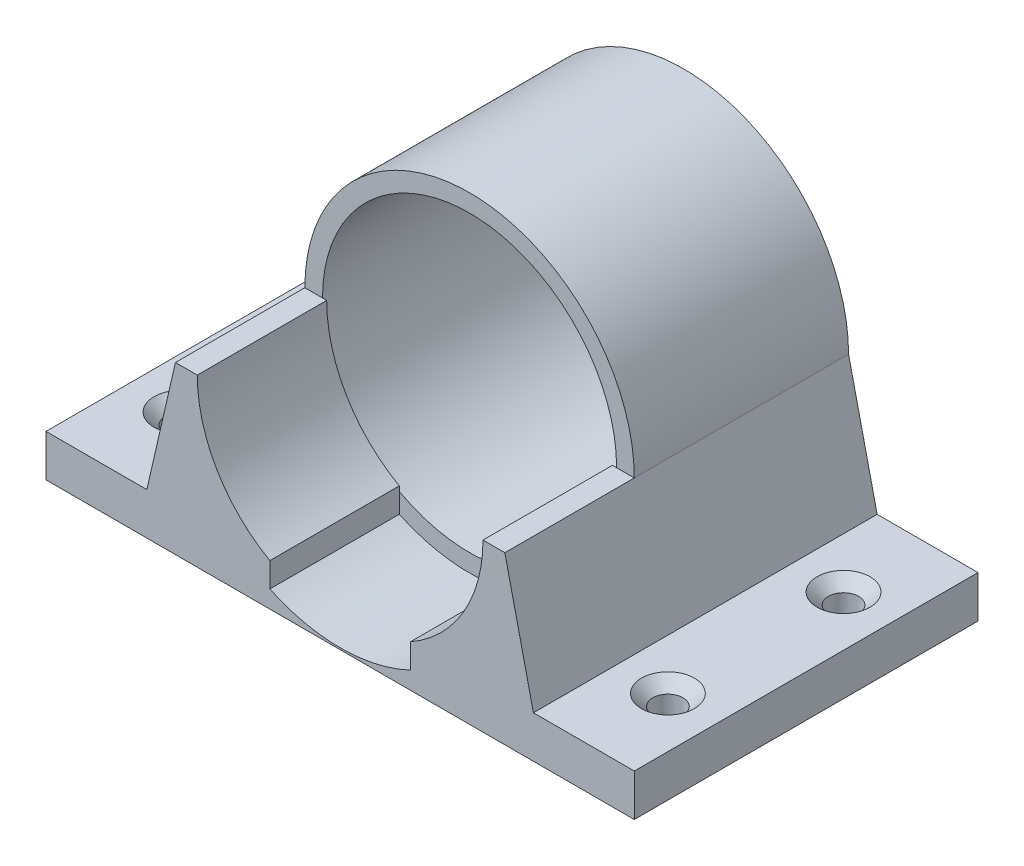
ISO-10303-21;
HEADER;
FILE_DESCRIPTION(('STEP AP214'),'2;1');
FILE_NAME('part.step','',(''),(''),'','','');
FILE_SCHEMA(('AUTOMOTIVE_DESIGN { 1 0 10303 214 1 1 1 1 }'));
ENDSEC;
DATA;
#1=APPLICATION_CONTEXT('core data for automotive mechanical design processes');
#2=APPLICATION_PROTOCOL_DEFINITION('international standard','automotive_design',2000,#1);
#3=PRODUCT_CONTEXT('',#1,'mechanical');
#4=PRODUCT('Part','Part','',(#3));
#5=PRODUCT_RELATED_PRODUCT_CATEGORY('part','',(#4));
#6=PRODUCT_DEFINITION_FORMATION('','',#4);
#7=PRODUCT_DEFINITION_CONTEXT('part definition',#1,'design');
#8=PRODUCT_DEFINITION('design','',#6,#7);
#9=PRODUCT_DEFINITION_SHAPE('','',#8);
#10=(LENGTH_UNIT() NAMED_UNIT(*) SI_UNIT(.MILLI.,.METRE.));
#11=(NAMED_UNIT(*) PLANE_ANGLE_UNIT() SI_UNIT($,.RADIAN.));
#12=(NAMED_UNIT(*) SI_UNIT($,.STERADIAN.) SOLID_ANGLE_UNIT());
#13=UNCERTAINTY_MEASURE_WITH_UNIT(LENGTH_MEASURE(1.E-05),#10,'distance_accuracy_value','');
#14=(GEOMETRIC_REPRESENTATION_CONTEXT(3) GLOBAL_UNCERTAINTY_ASSIGNED_CONTEXT((#13)) GLOBAL_UNIT_ASSIGNED_CONTEXT((#10,
#11,#12)) REPRESENTATION_CONTEXT('',''));
#15=CARTESIAN_POINT('',(0.,0.,0.));
#16=DIRECTION('',(0.,0.,1.));
#17=DIRECTION('',(1.,0.,0.));
#18=AXIS2_PLACEMENT_3D('',#15,#16,#17);
#19=CARTESIAN_POINT('',(0.,19.8,0.));
#20=DIRECTION('',(0.,0.,-1.));
#21=DIRECTION('',(-1.,0.,0.));
#22=AXIS2_PLACEMENT_3D('',#19,#20,#21);
#23=PLANE('',#22);
#24=DIRECTION('',(0.,-1.,0.));
#25=VECTOR('',#24,1.);
#26=CARTESIAN_POINT('',(8.36420946653059,0.,0.));
#27=LINE('',#26,#25);
#28=CARTESIAN_POINT('',(8.36420946653059,4.42827270603593,0.));
#29=VERTEX_POINT('',#28);
#30=CARTESIAN_POINT('',(8.36420946653059,2.07431242518361,0.));
#31=VERTEX_POINT('',#30);
#32=EDGE_CURVE('E78',#29,#31,#27,.T.);
#33=ORIENTED_EDGE('',*,*,#32,.F.);
#34=CARTESIAN_POINT('',(0.,19.8,0.));
#35=DIRECTION('',(0.,0.,1.));
#36=DIRECTION('',(1.,0.,0.));
#37=AXIS2_PLACEMENT_3D('',#34,#35,#36);
#38=CIRCLE('',#37,17.5);
#39=CARTESIAN_POINT('',(-8.36420946653059,4.42827270603593,0.));
#40=VERTEX_POINT('',#39);
#41=EDGE_CURVE('E392',#40,#29,#38,.T.);
#42=ORIENTED_EDGE('',*,*,#41,.F.);
#43=DIRECTION('',(0.,-1.,0.));
#44=VECTOR('',#43,1.);
#45=CARTESIAN_POINT('',(-8.36420946653059,0.,0.));
#46=LINE('',#45,#44);
#47=CARTESIAN_POINT('',(-8.36420946653059,2.07431242518361,0.));
#48=VERTEX_POINT('',#47);
#49=EDGE_CURVE('E236',#40,#48,#46,.T.);
#50=ORIENTED_EDGE('',*,*,#49,.T.);
#51=CARTESIAN_POINT('',(0.,19.8,0.));
#52=DIRECTION('',(0.,0.,1.));
#53=DIRECTION('',(1.,0.,0.));
#54=AXIS2_PLACEMENT_3D('',#51,#52,#53);
#55=CIRCLE('',#54,19.6);
#56=EDGE_CURVE('E388',#48,#31,#55,.T.);
#57=ORIENTED_EDGE('',*,*,#56,.T.);
#58=EDGE_LOOP('',(#33,#42,#50,#57));
#59=FACE_BOUND('',#58,.T.);
#60=ADVANCED_FACE('F54',(#59),#23,.F.);
#61=CARTESIAN_POINT('',(0.,19.8,15.4));
#62=DIRECTION('',(0.,0.,-1.));
#63=DIRECTION('',(-1.,0.,0.));
#64=AXIS2_PLACEMENT_3D('',#61,#62,#63);
#65=CYLINDRICAL_SURFACE('',#64,19.6);
#66=CARTESIAN_POINT('',(0.,19.8,15.4));
#67=DIRECTION('',(0.,0.,1.));
#68=DIRECTION('',(1.,0.,0.));
#69=AXIS2_PLACEMENT_3D('',#66,#67,#68);
#70=CIRCLE('',#69,19.6);
#71=CARTESIAN_POINT('',(-8.36420946653059,2.07431242518361,15.4));
#72=VERTEX_POINT('',#71);
#73=CARTESIAN_POINT('',(8.36420946653059,2.07431242518361,15.4));
#74=VERTEX_POINT('',#73);
#75=EDGE_CURVE('E330',#72,#74,#70,.T.);
#76=ORIENTED_EDGE('',*,*,#75,.T.);
#77=DIRECTION('',(0.,0.,-1.));
#78=VECTOR('',#77,1.);
#79=CARTESIAN_POINT('',(8.36420946653059,2.07431242518361,15.4));
#80=LINE('',#79,#78);
#81=EDGE_CURVE('E466',#74,#31,#80,.T.);
#82=ORIENTED_EDGE('',*,*,#81,.T.);
#83=ORIENTED_EDGE('',*,*,#56,.F.);
#84=DIRECTION('',(0.,0.,-1.));
#85=VECTOR('',#84,1.);
#86=CARTESIAN_POINT('',(-8.36420946653059,2.07431242518361,15.4));
#87=LINE('',#86,#85);
#88=EDGE_CURVE('E250',#72,#48,#87,.T.);
#89=ORIENTED_EDGE('',*,*,#88,.F.);
#90=EDGE_LOOP('',(#76,#82,#83,#89));
#91=FACE_BOUND('',#90,.T.);
#92=ADVANCED_FACE('F465',(#91),#65,.F.);
#93=CARTESIAN_POINT('',(0.,19.8,-25.5));
#94=DIRECTION('',(0.,0.,1.));
#95=DIRECTION('',(1.,0.,0.));
#96=AXIS2_PLACEMENT_3D('',#93,#94,#95);
#97=CYLINDRICAL_SURFACE('',#96,19.6);
#98=DIRECTION('',(0.,0.,-1.));
#99=VECTOR('',#98,1.);
#100=CARTESIAN_POINT('',(-19.6,19.8,15.4));
#101=LINE('',#100,#99);
#102=CARTESIAN_POINT('',(-19.6,19.8,0.));
#103=VERTEX_POINT('',#102);
#104=CARTESIAN_POINT('',(-19.6,19.8,-25.5));
#105=VERTEX_POINT('',#104);
#106=EDGE_CURVE('E361',#103,#105,#101,.T.);
#107=ORIENTED_EDGE('',*,*,#106,.F.);
#108=CARTESIAN_POINT('',(19.6,19.8,0.));
#109=VERTEX_POINT('',#108);
#110=EDGE_CURVE('E58',#109,#103,#55,.T.);
#111=ORIENTED_EDGE('',*,*,#110,.F.);
#112=DIRECTION('',(0.,0.,-1.));
#113=VECTOR('',#112,1.);
#114=CARTESIAN_POINT('',(19.6,19.8,15.4));
#115=LINE('',#114,#113);
#116=CARTESIAN_POINT('',(19.6,19.8,-25.5));
#117=VERTEX_POINT('',#116);
#118=EDGE_CURVE('E357',#109,#117,#115,.T.);
#119=ORIENTED_EDGE('',*,*,#118,.T.);
#120=CARTESIAN_POINT('',(0.,19.8,-25.5));
#121=DIRECTION('',(0.,0.,-1.));
#122=DIRECTION('',(-1.,0.,0.));
#123=AXIS2_PLACEMENT_3D('',#120,#121,#122);
#124=CIRCLE('',#123,19.6);
#125=EDGE_CURVE('E12',#105,#117,#124,.T.);
#126=ORIENTED_EDGE('',*,*,#125,.F.);
#127=EDGE_LOOP('',(#107,#111,#119,#126));
#128=FACE_BOUND('',#127,.T.);
#129=ADVANCED_FACE('F56',(#128),#97,.T.);
#130=CARTESIAN_POINT('',(0.,19.8,-25.5));
#131=DIRECTION('',(0.,0.,-1.));
#132=DIRECTION('',(-1.,0.,0.));
#133=AXIS2_PLACEMENT_3D('',#130,#131,#132);
#134=PLANE('',#133);
#135=CARTESIAN_POINT('',(0.,19.8,-25.5));
#136=DIRECTION('',(0.,0.,1.));
#137=DIRECTION('',(1.,0.,0.));
#138=AXIS2_PLACEMENT_3D('',#135,#136,#137);
#139=CIRCLE('',#138,17.5);
#140=CARTESIAN_POINT('',(17.5,19.8,-25.5));
#141=VERTEX_POINT('',#140);
#142=EDGE_CURVE('E384',#141,#141,#139,.T.);
#143=ORIENTED_EDGE('',*,*,#142,.T.);
#144=EDGE_LOOP('',(#143));
#145=FACE_BOUND('',#144,.T.);
#146=ORIENTED_EDGE('',*,*,#125,.T.);
#147=DIRECTION('',(0.22389751093591,-0.974612694662195,0.));
#148=VECTOR('',#147,1.);
#149=CARTESIAN_POINT('',(19.6,19.8,-25.5));
#150=LINE('',#149,#148);
#151=CARTESIAN_POINT('',(23.,5.,-25.5));
#152=VERTEX_POINT('',#151);
#153=EDGE_CURVE('E302',#117,#152,#150,.T.);
#154=ORIENTED_EDGE('',*,*,#153,.T.);
#155=DIRECTION('',(1.,0.,0.));
#156=VECTOR('',#155,1.);
#157=CARTESIAN_POINT('',(23.,5.,-25.5));
#158=LINE('',#157,#156);
#159=CARTESIAN_POINT('',(35.,5.,-25.5));
#160=VERTEX_POINT('',#159);
#161=EDGE_CURVE('E306',#152,#160,#158,.T.);
#162=ORIENTED_EDGE('',*,*,#161,.T.);
#163=DIRECTION('',(0.,-1.,0.));
#164=VECTOR('',#163,1.);
#165=CARTESIAN_POINT('',(35.,5.,-25.5));
#166=LINE('',#165,#164);
#167=CARTESIAN_POINT('',(35.,0.,-25.5));
#168=VERTEX_POINT('',#167);
#169=EDGE_CURVE('E310',#160,#168,#166,.T.);
#170=ORIENTED_EDGE('',*,*,#169,.T.);
#171=DIRECTION('',(1.,0.,0.));
#172=VECTOR('',#171,1.);
#173=CARTESIAN_POINT('',(-35.,0.,-25.5));
#174=LINE('',#173,#172);
#175=CARTESIAN_POINT('',(-35.,0.,-25.5));
#176=VERTEX_POINT('',#175);
#177=EDGE_CURVE('E314',#176,#168,#174,.T.);
#178=ORIENTED_EDGE('',*,*,#177,.F.);
#179=DIRECTION('',(0.,-1.,0.));
#180=VECTOR('',#179,1.);
#181=CARTESIAN_POINT('',(-35.,5.,-25.5));
#182=LINE('',#181,#180);
#183=CARTESIAN_POINT('',(-35.,5.,-25.5));
#184=VERTEX_POINT('',#183);
#185=EDGE_CURVE('E318',#184,#176,#182,.T.);
#186=ORIENTED_EDGE('',*,*,#185,.F.);
#187=DIRECTION('',(-1.,0.,0.));
#188=VECTOR('',#187,1.);
#189=CARTESIAN_POINT('',(-23.,5.,-25.5));
#190=LINE('',#189,#188);
#191=CARTESIAN_POINT('',(-23.,5.,-25.5));
#192=VERTEX_POINT('',#191);
#193=EDGE_CURVE('E322',#192,#184,#190,.T.);
#194=ORIENTED_EDGE('',*,*,#193,.F.);
#195=DIRECTION('',(0.22389751093591,0.974612694662195,0.));
#196=VECTOR('',#195,1.);
#197=CARTESIAN_POINT('',(-23.,5.,-25.5));
#198=LINE('',#197,#196);
#199=EDGE_CURVE('E326',#192,#105,#198,.T.);
#200=ORIENTED_EDGE('',*,*,#199,.T.);
#201=EDGE_LOOP('',(#146,#154,#162,#170,#178,#186,#194,#200));
#202=FACE_BOUND('',#201,.T.);
#203=ADVANCED_FACE('F425',(#145,#202),#134,.T.);
#204=CARTESIAN_POINT('',(17.5,19.8,0.));
#205=VERTEX_POINT('',#204);
#206=CARTESIAN_POINT('',(-17.5,19.8,0.));
#207=VERTEX_POINT('',#206);
#208=EDGE_CURVE('E70',#205,#207,#38,.T.);
#209=ORIENTED_EDGE('',*,*,#208,.F.);
#210=DIRECTION('',(1.,0.,0.));
#211=VECTOR('',#210,1.);
#212=CARTESIAN_POINT('',(0.,19.8,0.));
#213=LINE('',#212,#211);
#214=EDGE_CURVE('E187',#205,#109,#213,.T.);
#215=ORIENTED_EDGE('',*,*,#214,.T.);
#216=ORIENTED_EDGE('',*,*,#110,.T.);
#217=DIRECTION('',(1.,0.,0.));
#218=VECTOR('',#217,1.);
#219=CARTESIAN_POINT('',(0.,19.8,0.));
#220=LINE('',#219,#218);
#221=EDGE_CURVE('E233',#103,#207,#220,.T.);
#222=ORIENTED_EDGE('',*,*,#221,.T.);
#223=EDGE_LOOP('',(#209,#215,#216,#222));
#224=FACE_BOUND('',#223,.T.);
#225=ADVANCED_FACE('F402',(#224),#23,.F.);
#226=CARTESIAN_POINT('',(0.,19.8,-25.5));
#227=DIRECTION('',(0.,0.,1.));
#228=DIRECTION('',(1.,0.,0.));
#229=AXIS2_PLACEMENT_3D('',#226,#227,#228);
#230=CYLINDRICAL_SURFACE('',#229,17.5);
#231=ORIENTED_EDGE('',*,*,#142,.F.);
#232=EDGE_LOOP('',(#231));
#233=FACE_BOUND('',#232,.T.);
#234=EDGE_CURVE('E389',#207,#40,#38,.T.);
#235=ORIENTED_EDGE('',*,*,#234,.T.);
#236=ORIENTED_EDGE('',*,*,#41,.T.);
#237=CARTESIAN_POINT('',(0.,19.8,0.));
#238=DIRECTION('',(0.,0.,1.));
#239=DIRECTION('',(1.,0.,0.));
#240=AXIS2_PLACEMENT_3D('',#237,#238,#239);
#241=CIRCLE('',#240,17.5);
#242=EDGE_CURVE('E201',#205,#29,#241,.F.);
#243=ORIENTED_EDGE('',*,*,#242,.F.);
#244=ORIENTED_EDGE('',*,*,#208,.T.);
#245=EDGE_LOOP('',(#235,#236,#243,#244));
#246=FACE_BOUND('',#245,.T.);
#247=ADVANCED_FACE('F398',(#233,#246),#230,.F.);
#248=CARTESIAN_POINT('',(-23.,5.,15.4));
#249=DIRECTION('',(-0.974612694662195,0.22389751093591,0.));
#250=DIRECTION('',(-0.22389751093591,-0.974612694662195,0.));
#251=AXIS2_PLACEMENT_3D('',#248,#249,#250);
#252=PLANE('',#251);
#253=CARTESIAN_POINT('',(-19.6,19.8,15.4));
#254=VERTEX_POINT('',#253);
#255=EDGE_CURVE('E358',#254,#103,#101,.T.);
#256=ORIENTED_EDGE('',*,*,#255,.T.);
#257=ORIENTED_EDGE('',*,*,#106,.T.);
#258=ORIENTED_EDGE('',*,*,#199,.F.);
#259=DIRECTION('',(0.,0.,-1.));
#260=VECTOR('',#259,1.);
#261=CARTESIAN_POINT('',(-23.,5.,15.4));
#262=LINE('',#261,#260);
#263=CARTESIAN_POINT('',(-23.,5.,15.4));
#264=VERTEX_POINT('',#263);
#265=EDGE_CURVE('E362',#264,#192,#262,.T.);
#266=ORIENTED_EDGE('',*,*,#265,.F.);
#267=DIRECTION('',(0.22389751093591,0.974612694662195,0.));
#268=VECTOR('',#267,1.);
#269=CARTESIAN_POINT('',(-23.,5.,15.4));
#270=LINE('',#269,#268);
#271=EDGE_CURVE('E354',#264,#254,#270,.T.);
#272=ORIENTED_EDGE('',*,*,#271,.T.);
#273=EDGE_LOOP('',(#256,#257,#258,#266,#272));
#274=FACE_BOUND('',#273,.T.);
#275=ADVANCED_FACE('F420',(#274),#252,.T.);
#276=CARTESIAN_POINT('',(-23.,5.,15.4));
#277=DIRECTION('',(0.,-1.,0.));
#278=DIRECTION('',(1.,0.,0.));
#279=AXIS2_PLACEMENT_3D('',#276,#277,#278);
#280=PLANE('',#279);
#281=CARTESIAN_POINT('',(-29.,5.,-15.5));
#282=DIRECTION('',(0.,1.,0.));
#283=DIRECTION('',(0.,0.,1.));
#284=AXIS2_PLACEMENT_3D('',#281,#282,#283);
#285=CIRCLE('',#284,3.15);
#286=CARTESIAN_POINT('',(-29.,5.,-12.35));
#287=VERTEX_POINT('',#286);
#288=EDGE_CURVE('E278',#287,#287,#285,.T.);
#289=ORIENTED_EDGE('',*,*,#288,.F.);
#290=EDGE_LOOP('',(#289));
#291=FACE_BOUND('',#290,.T.);
#292=CARTESIAN_POINT('',(-29.,5.,5.4));
#293=DIRECTION('',(0.,1.,0.));
#294=DIRECTION('',(0.,0.,1.));
#295=AXIS2_PLACEMENT_3D('',#292,#293,#294);
#296=CIRCLE('',#295,3.15);
#297=CARTESIAN_POINT('',(-29.,5.,8.55));
#298=VERTEX_POINT('',#297);
#299=EDGE_CURVE('E290',#298,#298,#296,.T.);
#300=ORIENTED_EDGE('',*,*,#299,.F.);
#301=EDGE_LOOP('',(#300));
#302=FACE_BOUND('',#301,.T.);
#303=ORIENTED_EDGE('',*,*,#265,.T.);
#304=ORIENTED_EDGE('',*,*,#193,.T.);
#305=DIRECTION('',(0.,0.,-1.));
#306=VECTOR('',#305,1.);
#307=CARTESIAN_POINT('',(-35.,5.,15.4));
#308=LINE('',#307,#306);
#309=CARTESIAN_POINT('',(-35.,5.,15.4));
#310=VERTEX_POINT('',#309);
#311=EDGE_CURVE('E365',#310,#184,#308,.T.);
#312=ORIENTED_EDGE('',*,*,#311,.F.);
#313=DIRECTION('',(-1.,0.,0.));
#314=VECTOR('',#313,1.);
#315=CARTESIAN_POINT('',(-23.,5.,15.4));
#316=LINE('',#315,#314);
#317=EDGE_CURVE('E351',#264,#310,#316,.T.);
#318=ORIENTED_EDGE('',*,*,#317,.F.);
#319=EDGE_LOOP('',(#303,#304,#312,#318));
#320=FACE_BOUND('',#319,.T.);
#321=ADVANCED_FACE('F453',(#291,#302,#320),#280,.F.);
#322=CARTESIAN_POINT('',(-35.,5.,15.4));
#323=DIRECTION('',(1.,0.,0.));
#324=DIRECTION('',(0.,0.,-1.));
#325=AXIS2_PLACEMENT_3D('',#322,#323,#324);
#326=PLANE('',#325);
#327=ORIENTED_EDGE('',*,*,#311,.T.);
#328=ORIENTED_EDGE('',*,*,#185,.T.);
#329=DIRECTION('',(0.,0.,-1.));
#330=VECTOR('',#329,1.);
#331=CARTESIAN_POINT('',(-35.,0.,15.4));
#332=LINE('',#331,#330);
#333=CARTESIAN_POINT('',(-35.,0.,15.4));
#334=VERTEX_POINT('',#333);
#335=EDGE_CURVE('E368',#334,#176,#332,.T.);
#336=ORIENTED_EDGE('',*,*,#335,.F.);
#337=DIRECTION('',(0.,-1.,0.));
#338=VECTOR('',#337,1.);
#339=CARTESIAN_POINT('',(-35.,5.,15.4));
#340=LINE('',#339,#338);
#341=EDGE_CURVE('E348',#310,#334,#340,.T.);
#342=ORIENTED_EDGE('',*,*,#341,.F.);
#343=EDGE_LOOP('',(#327,#328,#336,#342));
#344=FACE_BOUND('',#343,.T.);
#345=ADVANCED_FACE('F449',(#344),#326,.F.);
#346=CARTESIAN_POINT('',(-35.,0.,15.4));
#347=DIRECTION('',(0.,1.,0.));
#348=DIRECTION('',(-1.,0.,0.));
#349=AXIS2_PLACEMENT_3D('',#346,#347,#348);
#350=PLANE('',#349);
#351=CARTESIAN_POINT('',(29.,0.,5.4));
#352=DIRECTION('',(0.,1.,0.));
#353=DIRECTION('',(0.,0.,1.));
#354=AXIS2_PLACEMENT_3D('',#351,#352,#353);
#355=CIRCLE('',#354,1.8);
#356=CARTESIAN_POINT('',(29.,0.,7.2));
#357=VERTEX_POINT('',#356);
#358=EDGE_CURVE('E262',#357,#357,#355,.T.);
#359=ORIENTED_EDGE('',*,*,#358,.T.);
#360=EDGE_LOOP('',(#359));
#361=FACE_BOUND('',#360,.T.);
#362=CARTESIAN_POINT('',(28.9999999999999,0.,-15.5000000000002));
#363=DIRECTION('',(0.,1.,0.));
#364=DIRECTION('',(0.,0.,1.));
#365=AXIS2_PLACEMENT_3D('',#362,#363,#364);
#366=CIRCLE('',#365,1.8);
#367=CARTESIAN_POINT('',(28.9999999999999,0.,-13.7000000000002));
#368=VERTEX_POINT('',#367);
#369=EDGE_CURVE('E274',#368,#368,#366,.T.);
#370=ORIENTED_EDGE('',*,*,#369,.T.);
#371=EDGE_LOOP('',(#370));
#372=FACE_BOUND('',#371,.T.);
#373=CARTESIAN_POINT('',(-29.,0.,-15.5));
#374=DIRECTION('',(0.,1.,0.));
#375=DIRECTION('',(0.,0.,1.));
#376=AXIS2_PLACEMENT_3D('',#373,#374,#375);
#377=CIRCLE('',#376,1.8);
#378=CARTESIAN_POINT('',(-29.,0.,-13.7));
#379=VERTEX_POINT('',#378);
#380=EDGE_CURVE('E286',#379,#379,#377,.T.);
#381=ORIENTED_EDGE('',*,*,#380,.T.);
#382=EDGE_LOOP('',(#381));
#383=FACE_BOUND('',#382,.T.);
#384=CARTESIAN_POINT('',(-29.,0.,5.4));
#385=DIRECTION('',(0.,1.,0.));
#386=DIRECTION('',(0.,0.,1.));
#387=AXIS2_PLACEMENT_3D('',#384,#385,#386);
#388=CIRCLE('',#387,1.8);
#389=CARTESIAN_POINT('',(-29.,0.,7.2));
#390=VERTEX_POINT('',#389);
#391=EDGE_CURVE('E298',#390,#390,#388,.T.);
#392=ORIENTED_EDGE('',*,*,#391,.T.);
#393=EDGE_LOOP('',(#392));
#394=FACE_BOUND('',#393,.T.);
#395=ORIENTED_EDGE('',*,*,#335,.T.);
#396=ORIENTED_EDGE('',*,*,#177,.T.);
#397=DIRECTION('',(0.,0.,-1.));
#398=VECTOR('',#397,1.);
#399=CARTESIAN_POINT('',(35.,0.,15.4));
#400=LINE('',#399,#398);
#401=CARTESIAN_POINT('',(35.,0.,15.4));
#402=VERTEX_POINT('',#401);
#403=EDGE_CURVE('E371',#402,#168,#400,.T.);
#404=ORIENTED_EDGE('',*,*,#403,.F.);
#405=DIRECTION('',(1.,0.,0.));
#406=VECTOR('',#405,1.);
#407=CARTESIAN_POINT('',(-35.,0.,15.4));
#408=LINE('',#407,#406);
#409=EDGE_CURVE('E345',#334,#402,#408,.T.);
#410=ORIENTED_EDGE('',*,*,#409,.F.);
#411=EDGE_LOOP('',(#395,#396,#404,#410));
#412=FACE_BOUND('',#411,.T.);
#413=ADVANCED_FACE('F446',(#361,#372,#383,#394,#412),#350,.F.);
#414=CARTESIAN_POINT('',(35.,5.,15.4));
#415=DIRECTION('',(1.,0.,0.));
#416=DIRECTION('',(0.,0.,-1.));
#417=AXIS2_PLACEMENT_3D('',#414,#415,#416);
#418=PLANE('',#417);
#419=ORIENTED_EDGE('',*,*,#403,.T.);
#420=ORIENTED_EDGE('',*,*,#169,.F.);
#421=DIRECTION('',(0.,0.,-1.));
#422=VECTOR('',#421,1.);
#423=CARTESIAN_POINT('',(35.,5.,15.4));
#424=LINE('',#423,#422);
#425=CARTESIAN_POINT('',(35.,5.,15.4));
#426=VERTEX_POINT('',#425);
#427=EDGE_CURVE('E374',#426,#160,#424,.T.);
#428=ORIENTED_EDGE('',*,*,#427,.F.);
#429=DIRECTION('',(0.,-1.,0.));
#430=VECTOR('',#429,1.);
#431=CARTESIAN_POINT('',(35.,5.,15.4));
#432=LINE('',#431,#430);
#433=EDGE_CURVE('E341',#426,#402,#432,.T.);
#434=ORIENTED_EDGE('',*,*,#433,.T.);
#435=EDGE_LOOP('',(#419,#420,#428,#434));
#436=FACE_BOUND('',#435,.T.);
#437=ADVANCED_FACE('F438',(#436),#418,.T.);
#438=CARTESIAN_POINT('',(23.,5.,15.4));
#439=DIRECTION('',(0.,1.,0.));
#440=DIRECTION('',(-1.,0.,0.));
#441=AXIS2_PLACEMENT_3D('',#438,#439,#440);
#442=PLANE('',#441);
#443=CARTESIAN_POINT('',(29.,5.,5.4));
#444=DIRECTION('',(0.,1.,0.));
#445=DIRECTION('',(0.,0.,1.));
#446=AXIS2_PLACEMENT_3D('',#443,#444,#445);
#447=CIRCLE('',#446,3.15);
#448=CARTESIAN_POINT('',(29.,5.,8.55));
#449=VERTEX_POINT('',#448);
#450=EDGE_CURVE('E254',#449,#449,#447,.T.);
#451=ORIENTED_EDGE('',*,*,#450,.F.);
#452=EDGE_LOOP('',(#451));
#453=FACE_BOUND('',#452,.T.);
#454=CARTESIAN_POINT('',(28.9999999999999,5.,-15.5000000000002));
#455=DIRECTION('',(0.,1.,0.));
#456=DIRECTION('',(0.,0.,1.));
#457=AXIS2_PLACEMENT_3D('',#454,#455,#456);
#458=CIRCLE('',#457,3.15);
#459=CARTESIAN_POINT('',(28.9999999999999,5.,-12.3500000000002));
#460=VERTEX_POINT('',#459);
#461=EDGE_CURVE('E266',#460,#460,#458,.T.);
#462=ORIENTED_EDGE('',*,*,#461,.F.);
#463=EDGE_LOOP('',(#462));
#464=FACE_BOUND('',#463,.T.);
#465=ORIENTED_EDGE('',*,*,#427,.T.);
#466=ORIENTED_EDGE('',*,*,#161,.F.);
#467=DIRECTION('',(0.,0.,-1.));
#468=VECTOR('',#467,1.);
#469=CARTESIAN_POINT('',(23.,5.,15.4));
#470=LINE('',#469,#468);
#471=CARTESIAN_POINT('',(23.,5.,15.4));
#472=VERTEX_POINT('',#471);
#473=EDGE_CURVE('E377',#472,#152,#470,.T.);
#474=ORIENTED_EDGE('',*,*,#473,.F.);
#475=DIRECTION('',(1.,0.,0.));
#476=VECTOR('',#475,1.);
#477=CARTESIAN_POINT('',(23.,5.,15.4));
#478=LINE('',#477,#476);
#479=EDGE_CURVE('E337',#472,#426,#478,.T.);
#480=ORIENTED_EDGE('',*,*,#479,.T.);
#481=EDGE_LOOP('',(#465,#466,#474,#480));
#482=FACE_BOUND('',#481,.T.);
#483=ADVANCED_FACE('F434',(#453,#464,#482),#442,.T.);
#484=CARTESIAN_POINT('',(19.6,19.8,15.4));
#485=DIRECTION('',(0.974612694662195,0.22389751093591,0.));
#486=DIRECTION('',(-0.22389751093591,0.974612694662195,0.));
#487=AXIS2_PLACEMENT_3D('',#484,#485,#486);
#488=PLANE('',#487);
#489=ORIENTED_EDGE('',*,*,#473,.T.);
#490=ORIENTED_EDGE('',*,*,#153,.F.);
#491=ORIENTED_EDGE('',*,*,#118,.F.);
#492=CARTESIAN_POINT('',(19.6,19.8,15.4));
#493=VERTEX_POINT('',#492);
#494=EDGE_CURVE('E380',#493,#109,#115,.T.);
#495=ORIENTED_EDGE('',*,*,#494,.F.);
#496=DIRECTION('',(0.22389751093591,-0.974612694662195,0.));
#497=VECTOR('',#496,1.);
#498=CARTESIAN_POINT('',(19.6,19.8,15.4));
#499=LINE('',#498,#497);
#500=EDGE_CURVE('E333',#493,#472,#499,.T.);
#501=ORIENTED_EDGE('',*,*,#500,.T.);
#502=EDGE_LOOP('',(#489,#490,#491,#495,#501));
#503=FACE_BOUND('',#502,.T.);
#504=ADVANCED_FACE('F430',(#503),#488,.T.);
#505=CARTESIAN_POINT('',(0.,19.8,15.4));
#506=DIRECTION('',(0.,0.,1.));
#507=DIRECTION('',(1.,0.,0.));
#508=AXIS2_PLACEMENT_3D('',#505,#506,#507);
#509=PLANE('',#508);
#510=ORIENTED_EDGE('',*,*,#75,.F.);
#511=DIRECTION('',(0.,-1.,0.));
#512=VECTOR('',#511,1.);
#513=CARTESIAN_POINT('',(-8.36420946653059,0.,15.4));
#514=LINE('',#513,#512);
#515=CARTESIAN_POINT('',(-8.36420946653059,5.,15.4));
#516=VERTEX_POINT('',#515);
#517=EDGE_CURVE('E223',#516,#72,#514,.T.);
#518=ORIENTED_EDGE('',*,*,#517,.F.);
#519=CARTESIAN_POINT('',(0.,19.8,15.4));
#520=DIRECTION('',(0.,0.,1.));
#521=DIRECTION('',(1.,0.,0.));
#522=AXIS2_PLACEMENT_3D('',#519,#520,#521);
#523=CIRCLE('',#522,17.);
#524=CARTESIAN_POINT('',(-17.,19.8,15.4));
#525=VERTEX_POINT('',#524);
#526=EDGE_CURVE('E228',#525,#516,#523,.T.);
#527=ORIENTED_EDGE('',*,*,#526,.F.);
#528=DIRECTION('',(1.,0.,0.));
#529=VECTOR('',#528,1.);
#530=CARTESIAN_POINT('',(0.,19.8,15.4));
#531=LINE('',#530,#529);
#532=EDGE_CURVE('E219',#254,#525,#531,.T.);
#533=ORIENTED_EDGE('',*,*,#532,.F.);
#534=ORIENTED_EDGE('',*,*,#271,.F.);
#535=ORIENTED_EDGE('',*,*,#317,.T.);
#536=ORIENTED_EDGE('',*,*,#341,.T.);
#537=ORIENTED_EDGE('',*,*,#409,.T.);
#538=ORIENTED_EDGE('',*,*,#433,.F.);
#539=ORIENTED_EDGE('',*,*,#479,.F.);
#540=ORIENTED_EDGE('',*,*,#500,.F.);
#541=DIRECTION('',(1.,0.,0.));
#542=VECTOR('',#541,1.);
#543=CARTESIAN_POINT('',(0.,19.8,15.4));
#544=LINE('',#543,#542);
#545=CARTESIAN_POINT('',(17.,19.8,15.4));
#546=VERTEX_POINT('',#545);
#547=EDGE_CURVE('E213',#546,#493,#544,.T.);
#548=ORIENTED_EDGE('',*,*,#547,.F.);
#549=CARTESIAN_POINT('',(0.,19.8,15.4));
#550=DIRECTION('',(0.,0.,1.));
#551=DIRECTION('',(1.,0.,0.));
#552=AXIS2_PLACEMENT_3D('',#549,#550,#551);
#553=CIRCLE('',#552,17.);
#554=CARTESIAN_POINT('',(8.36420946653059,5.,15.4));
#555=VERTEX_POINT('',#554);
#556=EDGE_CURVE('E197',#546,#555,#553,.F.);
#557=ORIENTED_EDGE('',*,*,#556,.T.);
#558=DIRECTION('',(0.,-1.,0.));
#559=VECTOR('',#558,1.);
#560=CARTESIAN_POINT('',(8.36420946653059,0.,15.4));
#561=LINE('',#560,#559);
#562=EDGE_CURVE('E188',#555,#74,#561,.T.);
#563=ORIENTED_EDGE('',*,*,#562,.T.);
#564=EDGE_LOOP('',(#510,#518,#527,#533,#534,#535,#536,#537,#538,#539,#540,#548,#557,#563));
#565=FACE_BOUND('',#564,.T.);
#566=ADVANCED_FACE('F440',(#565),#509,.T.);
#567=CARTESIAN_POINT('',(-29.,5.,5.4));
#568=DIRECTION('',(0.,1.,0.));
#569=DIRECTION('',(0.,0.,1.));
#570=AXIS2_PLACEMENT_3D('',#567,#568,#569);
#571=CYLINDRICAL_SURFACE('',#570,1.8);
#572=ORIENTED_EDGE('',*,*,#391,.F.);
#573=EDGE_LOOP('',(#572));
#574=FACE_BOUND('',#573,.T.);
#575=CARTESIAN_POINT('',(-29.,3.65,5.4));
#576=DIRECTION('',(0.,1.,0.));
#577=DIRECTION('',(0.,0.,1.));
#578=AXIS2_PLACEMENT_3D('',#575,#576,#577);
#579=CIRCLE('',#578,1.8);
#580=CARTESIAN_POINT('',(-29.,3.65,7.2));
#581=VERTEX_POINT('',#580);
#582=EDGE_CURVE('E294',#581,#581,#579,.T.);
#583=ORIENTED_EDGE('',*,*,#582,.T.);
#584=EDGE_LOOP('',(#583));
#585=FACE_BOUND('',#584,.T.);
#586=ADVANCED_FACE('F523',(#574,#585),#571,.F.);
#587=CARTESIAN_POINT('',(-29.,5.,5.4));
#588=DIRECTION('',(0.,1.,0.));
#589=DIRECTION('',(0.,0.,1.));
#590=AXIS2_PLACEMENT_3D('',#587,#588,#589);
#591=CONICAL_SURFACE('',#590,3.15,0.785398163397448);
#592=ORIENTED_EDGE('',*,*,#582,.F.);
#593=EDGE_LOOP('',(#592));
#594=FACE_BOUND('',#593,.T.);
#595=ORIENTED_EDGE('',*,*,#299,.T.);
#596=EDGE_LOOP('',(#595));
#597=FACE_BOUND('',#596,.T.);
#598=ADVANCED_FACE('F526',(#594,#597),#591,.F.);
#599=CARTESIAN_POINT('',(-29.,5.,-15.5));
#600=DIRECTION('',(0.,1.,0.));
#601=DIRECTION('',(0.,0.,1.));
#602=AXIS2_PLACEMENT_3D('',#599,#600,#601);
#603=CYLINDRICAL_SURFACE('',#602,1.8);
#604=ORIENTED_EDGE('',*,*,#380,.F.);
#605=EDGE_LOOP('',(#604));
#606=FACE_BOUND('',#605,.T.);
#607=CARTESIAN_POINT('',(-29.,3.65,-15.5));
#608=DIRECTION('',(0.,1.,0.));
#609=DIRECTION('',(0.,0.,1.));
#610=AXIS2_PLACEMENT_3D('',#607,#608,#609);
#611=CIRCLE('',#610,1.8);
#612=CARTESIAN_POINT('',(-29.,3.65,-13.7));
#613=VERTEX_POINT('',#612);
#614=EDGE_CURVE('E282',#613,#613,#611,.T.);
#615=ORIENTED_EDGE('',*,*,#614,.T.);
#616=EDGE_LOOP('',(#615));
#617=FACE_BOUND('',#616,.T.);
#618=ADVANCED_FACE('F530',(#606,#617),#603,.F.);
#619=CARTESIAN_POINT('',(-29.,5.,-15.5));
#620=DIRECTION('',(0.,1.,0.));
#621=DIRECTION('',(0.,0.,1.));
#622=AXIS2_PLACEMENT_3D('',#619,#620,#621);
#623=CONICAL_SURFACE('',#622,3.15,0.785398163397448);
#624=ORIENTED_EDGE('',*,*,#614,.F.);
#625=EDGE_LOOP('',(#624));
#626=FACE_BOUND('',#625,.T.);
#627=ORIENTED_EDGE('',*,*,#288,.T.);
#628=EDGE_LOOP('',(#627));
#629=FACE_BOUND('',#628,.T.);
#630=ADVANCED_FACE('F534',(#626,#629),#623,.F.);
#631=CARTESIAN_POINT('',(28.9999999999999,5.,-15.5000000000002));
#632=DIRECTION('',(0.,1.,0.));
#633=DIRECTION('',(0.,0.,1.));
#634=AXIS2_PLACEMENT_3D('',#631,#632,#633);
#635=CYLINDRICAL_SURFACE('',#634,1.79999999999999);
#636=ORIENTED_EDGE('',*,*,#369,.F.);
#637=EDGE_LOOP('',(#636));
#638=FACE_BOUND('',#637,.T.);
#639=CARTESIAN_POINT('',(28.9999999999999,3.65,-15.5000000000002));
#640=DIRECTION('',(0.,1.,0.));
#641=DIRECTION('',(0.,0.,1.));
#642=AXIS2_PLACEMENT_3D('',#639,#640,#641);
#643=CIRCLE('',#642,1.79999999999999);
#644=CARTESIAN_POINT('',(28.9999999999999,3.65,-13.7000000000002));
#645=VERTEX_POINT('',#644);
#646=EDGE_CURVE('E270',#645,#645,#643,.T.);
#647=ORIENTED_EDGE('',*,*,#646,.T.);
#648=EDGE_LOOP('',(#647));
#649=FACE_BOUND('',#648,.T.);
#650=ADVANCED_FACE('F538',(#638,#649),#635,.F.);
#651=CARTESIAN_POINT('',(28.9999999999999,5.,-15.5000000000002));
#652=DIRECTION('',(0.,1.,0.));
#653=DIRECTION('',(0.,0.,1.));
#654=AXIS2_PLACEMENT_3D('',#651,#652,#653);
#655=CONICAL_SURFACE('',#654,3.15,0.78539816339745);
#656=ORIENTED_EDGE('',*,*,#646,.F.);
#657=EDGE_LOOP('',(#656));
#658=FACE_BOUND('',#657,.T.);
#659=ORIENTED_EDGE('',*,*,#461,.T.);
#660=EDGE_LOOP('',(#659));
#661=FACE_BOUND('',#660,.T.);
#662=ADVANCED_FACE('F542',(#658,#661),#655,.F.);
#663=CARTESIAN_POINT('',(29.,5.,5.4));
#664=DIRECTION('',(0.,1.,0.));
#665=DIRECTION('',(0.,0.,1.));
#666=AXIS2_PLACEMENT_3D('',#663,#664,#665);
#667=CYLINDRICAL_SURFACE('',#666,1.79999999999999);
#668=ORIENTED_EDGE('',*,*,#358,.F.);
#669=EDGE_LOOP('',(#668));
#670=FACE_BOUND('',#669,.T.);
#671=CARTESIAN_POINT('',(29.,3.65,5.4));
#672=DIRECTION('',(0.,1.,0.));
#673=DIRECTION('',(0.,0.,1.));
#674=AXIS2_PLACEMENT_3D('',#671,#672,#673);
#675=CIRCLE('',#674,1.79999999999999);
#676=CARTESIAN_POINT('',(29.,3.65,7.19999999999998));
#677=VERTEX_POINT('',#676);
#678=EDGE_CURVE('E258',#677,#677,#675,.T.);
#679=ORIENTED_EDGE('',*,*,#678,.T.);
#680=EDGE_LOOP('',(#679));
#681=FACE_BOUND('',#680,.T.);
#682=ADVANCED_FACE('F546',(#670,#681),#667,.F.);
#683=CARTESIAN_POINT('',(29.,5.,5.4));
#684=DIRECTION('',(0.,1.,0.));
#685=DIRECTION('',(0.,0.,1.));
#686=AXIS2_PLACEMENT_3D('',#683,#684,#685);
#687=CONICAL_SURFACE('',#686,3.15,0.78539816339745);
#688=ORIENTED_EDGE('',*,*,#678,.F.);
#689=EDGE_LOOP('',(#688));
#690=FACE_BOUND('',#689,.T.);
#691=ORIENTED_EDGE('',*,*,#450,.T.);
#692=EDGE_LOOP('',(#691));
#693=FACE_BOUND('',#692,.T.);
#694=ADVANCED_FACE('F550',(#690,#693),#687,.F.);
#695=CARTESIAN_POINT('',(0.,0.,0.));
#696=DIRECTION('',(0.,0.,1.));
#697=DIRECTION('',(1.,0.,0.));
#698=AXIS2_PLACEMENT_3D('',#695,#696,#697);
#699=PLANE('',#698);
#700=CARTESIAN_POINT('',(-8.36420946653059,5.,0.));
#701=VERTEX_POINT('',#700);
#702=EDGE_CURVE('E237',#701,#40,#46,.T.);
#703=ORIENTED_EDGE('',*,*,#702,.T.);
#704=ORIENTED_EDGE('',*,*,#234,.F.);
#705=CARTESIAN_POINT('',(-17.,19.8,0.));
#706=VERTEX_POINT('',#705);
#707=EDGE_CURVE('E206',#207,#706,#220,.T.);
#708=ORIENTED_EDGE('',*,*,#707,.T.);
#709=CARTESIAN_POINT('',(0.,19.8,0.));
#710=DIRECTION('',(0.,0.,1.));
#711=DIRECTION('',(1.,0.,0.));
#712=AXIS2_PLACEMENT_3D('',#709,#710,#711);
#713=CIRCLE('',#712,17.);
#714=EDGE_CURVE('E224',#706,#701,#713,.T.);
#715=ORIENTED_EDGE('',*,*,#714,.T.);
#716=EDGE_LOOP('',(#703,#704,#708,#715));
#717=FACE_BOUND('',#716,.T.);
#718=ADVANCED_FACE('F408',(#717),#699,.F.);
#719=CARTESIAN_POINT('',(0.,19.8,15.4));
#720=DIRECTION('',(0.,1.,0.));
#721=DIRECTION('',(-1.,0.,0.));
#722=AXIS2_PLACEMENT_3D('',#719,#720,#721);
#723=PLANE('',#722);
#724=ORIENTED_EDGE('',*,*,#221,.F.);
#725=ORIENTED_EDGE('',*,*,#255,.F.);
#726=ORIENTED_EDGE('',*,*,#532,.T.);
#727=DIRECTION('',(0.,0.,-1.));
#728=VECTOR('',#727,1.);
#729=CARTESIAN_POINT('',(-17.,19.8,15.4));
#730=LINE('',#729,#728);
#731=EDGE_CURVE('E232',#525,#706,#730,.T.);
#732=ORIENTED_EDGE('',*,*,#731,.T.);
#733=ORIENTED_EDGE('',*,*,#707,.F.);
#734=EDGE_LOOP('',(#724,#725,#726,#732,#733));
#735=FACE_BOUND('',#734,.T.);
#736=ADVANCED_FACE('F410',(#735),#723,.T.);
#737=CARTESIAN_POINT('',(-8.36420946653059,0.,15.4));
#738=DIRECTION('',(1.,0.,0.));
#739=DIRECTION('',(0.,0.,-1.));
#740=AXIS2_PLACEMENT_3D('',#737,#738,#739);
#741=PLANE('',#740);
#742=ORIENTED_EDGE('',*,*,#702,.F.);
#743=DIRECTION('',(0.,0.,-1.));
#744=VECTOR('',#743,1.);
#745=CARTESIAN_POINT('',(-8.36420946653059,5.,15.4));
#746=LINE('',#745,#744);
#747=EDGE_CURVE('E247',#516,#701,#746,.T.);
#748=ORIENTED_EDGE('',*,*,#747,.F.);
#749=ORIENTED_EDGE('',*,*,#517,.T.);
#750=ORIENTED_EDGE('',*,*,#88,.T.);
#751=ORIENTED_EDGE('',*,*,#49,.F.);
#752=EDGE_LOOP('',(#742,#748,#749,#750,#751));
#753=FACE_BOUND('',#752,.T.);
#754=ADVANCED_FACE('F461',(#753),#741,.T.);
#755=CARTESIAN_POINT('',(0.,19.8,15.4));
#756=DIRECTION('',(0.,0.,-1.));
#757=DIRECTION('',(-1.,0.,0.));
#758=AXIS2_PLACEMENT_3D('',#755,#756,#757);
#759=CYLINDRICAL_SURFACE('',#758,17.);
#760=ORIENTED_EDGE('',*,*,#714,.F.);
#761=ORIENTED_EDGE('',*,*,#731,.F.);
#762=ORIENTED_EDGE('',*,*,#526,.T.);
#763=ORIENTED_EDGE('',*,*,#747,.T.);
#764=EDGE_LOOP('',(#760,#761,#762,#763));
#765=FACE_BOUND('',#764,.T.);
#766=ADVANCED_FACE('F459',(#765),#759,.F.);
#767=CARTESIAN_POINT('',(0.,0.,0.));
#768=DIRECTION('',(0.,0.,1.));
#769=DIRECTION('',(1.,0.,0.));
#770=AXIS2_PLACEMENT_3D('',#767,#768,#769);
#771=PLANE('',#770);
#772=CARTESIAN_POINT('',(17.,19.8,0.));
#773=VERTEX_POINT('',#772);
#774=EDGE_CURVE('E208',#773,#205,#213,.T.);
#775=ORIENTED_EDGE('',*,*,#774,.T.);
#776=ORIENTED_EDGE('',*,*,#242,.T.);
#777=CARTESIAN_POINT('',(8.36420946653059,5.,0.));
#778=VERTEX_POINT('',#777);
#779=EDGE_CURVE('E193',#778,#29,#27,.T.);
#780=ORIENTED_EDGE('',*,*,#779,.F.);
#781=CARTESIAN_POINT('',(0.,19.8,0.));
#782=DIRECTION('',(0.,0.,1.));
#783=DIRECTION('',(1.,0.,0.));
#784=AXIS2_PLACEMENT_3D('',#781,#782,#783);
#785=CIRCLE('',#784,17.);
#786=EDGE_CURVE('E175',#773,#778,#785,.F.);
#787=ORIENTED_EDGE('',*,*,#786,.F.);
#788=EDGE_LOOP('',(#775,#776,#780,#787));
#789=FACE_BOUND('',#788,.T.);
#790=ADVANCED_FACE('F200',(#789),#771,.F.);
#791=CARTESIAN_POINT('',(8.36420946653059,0.,15.4));
#792=DIRECTION('',(1.,0.,0.));
#793=DIRECTION('',(0.,0.,-1.));
#794=AXIS2_PLACEMENT_3D('',#791,#792,#793);
#795=PLANE('',#794);
#796=ORIENTED_EDGE('',*,*,#779,.T.);
#797=ORIENTED_EDGE('',*,*,#32,.T.);
#798=ORIENTED_EDGE('',*,*,#81,.F.);
#799=ORIENTED_EDGE('',*,*,#562,.F.);
#800=DIRECTION('',(0.,0.,-1.));
#801=VECTOR('',#800,1.);
#802=CARTESIAN_POINT('',(8.36420946653059,5.,15.4));
#803=LINE('',#802,#801);
#804=EDGE_CURVE('E179',#555,#778,#803,.T.);
#805=ORIENTED_EDGE('',*,*,#804,.T.);
#806=EDGE_LOOP('',(#796,#797,#798,#799,#805));
#807=FACE_BOUND('',#806,.T.);
#808=ADVANCED_FACE('F192',(#807),#795,.F.);
#809=CARTESIAN_POINT('',(0.,19.8,15.4));
#810=DIRECTION('',(0.,1.,0.));
#811=DIRECTION('',(-1.,0.,0.));
#812=AXIS2_PLACEMENT_3D('',#809,#810,#811);
#813=PLANE('',#812);
#814=ORIENTED_EDGE('',*,*,#774,.F.);
#815=DIRECTION('',(0.,0.,-1.));
#816=VECTOR('',#815,1.);
#817=CARTESIAN_POINT('',(17.,19.8,15.4));
#818=LINE('',#817,#816);
#819=EDGE_CURVE('E181',#546,#773,#818,.T.);
#820=ORIENTED_EDGE('',*,*,#819,.F.);
#821=ORIENTED_EDGE('',*,*,#547,.T.);
#822=ORIENTED_EDGE('',*,*,#494,.T.);
#823=ORIENTED_EDGE('',*,*,#214,.F.);
#824=EDGE_LOOP('',(#814,#820,#821,#822,#823));
#825=FACE_BOUND('',#824,.T.);
#826=ADVANCED_FACE('F476',(#825),#813,.T.);
#827=CARTESIAN_POINT('',(0.,19.8,15.4));
#828=DIRECTION('',(0.,0.,-1.));
#829=DIRECTION('',(-1.,0.,0.));
#830=AXIS2_PLACEMENT_3D('',#827,#828,#829);
#831=CYLINDRICAL_SURFACE('',#830,17.);
#832=ORIENTED_EDGE('',*,*,#786,.T.);
#833=ORIENTED_EDGE('',*,*,#804,.F.);
#834=ORIENTED_EDGE('',*,*,#556,.F.);
#835=ORIENTED_EDGE('',*,*,#819,.T.);
#836=EDGE_LOOP('',(#832,#833,#834,#835));
#837=FACE_BOUND('',#836,.T.);
#838=ADVANCED_FACE('F177',(#837),#831,.F.);
#839=CLOSED_SHELL('',(#60,#92,#129,#203,#225,#247,#275,#321,#345,#413,#437,#483,#504,#566,#586,
#598,#618,#630,#650,#662,#682,#694,#718,#736,#754,#766,#790,#808,#826,#838));
#840=MANIFOLD_SOLID_BREP('B2',#839);
#841=ADVANCED_BREP_SHAPE_REPRESENTATION('',(#18,#840),#14);
#842=SHAPE_DEFINITION_REPRESENTATION(#9,#841);
ENDSEC;
END-ISO-10303-21;
